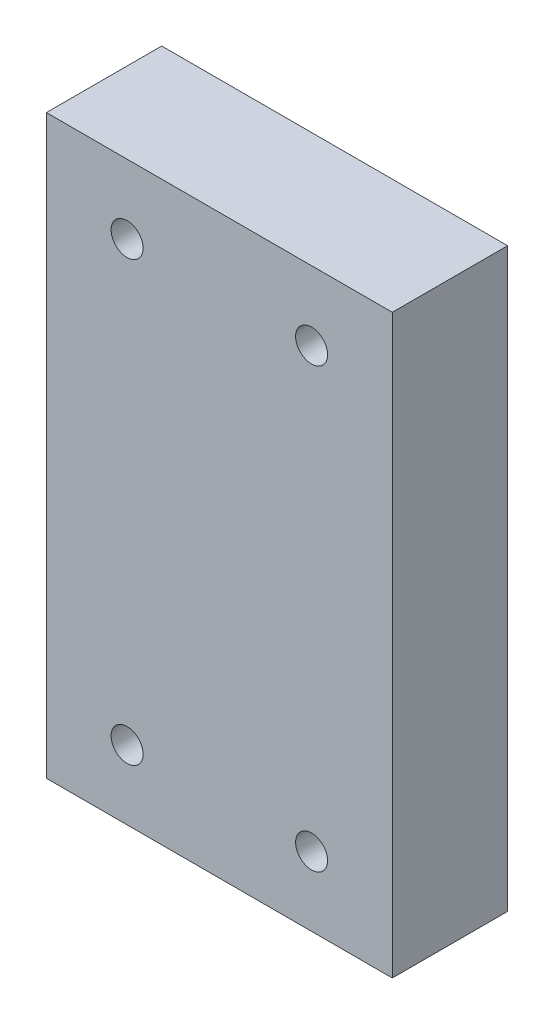
ISO-10303-21;
HEADER;
FILE_DESCRIPTION(('STEP AP214'),'2;1');
FILE_NAME('part.step','',(''),(''),'','','');
FILE_SCHEMA(('AUTOMOTIVE_DESIGN { 1 0 10303 214 1 1 1 1 }'));
ENDSEC;
DATA;
#1=APPLICATION_CONTEXT('core data for automotive mechanical design processes');
#2=APPLICATION_PROTOCOL_DEFINITION('international standard','automotive_design',2000,#1);
#3=PRODUCT_CONTEXT('',#1,'mechanical');
#4=PRODUCT('Part','Part','',(#3));
#5=PRODUCT_RELATED_PRODUCT_CATEGORY('part','',(#4));
#6=PRODUCT_DEFINITION_FORMATION('','',#4);
#7=PRODUCT_DEFINITION_CONTEXT('part definition',#1,'design');
#8=PRODUCT_DEFINITION('design','',#6,#7);
#9=PRODUCT_DEFINITION_SHAPE('','',#8);
#10=(LENGTH_UNIT() NAMED_UNIT(*) SI_UNIT(.MILLI.,.METRE.));
#11=(NAMED_UNIT(*) PLANE_ANGLE_UNIT() SI_UNIT($,.RADIAN.));
#12=(NAMED_UNIT(*) SI_UNIT($,.STERADIAN.) SOLID_ANGLE_UNIT());
#13=UNCERTAINTY_MEASURE_WITH_UNIT(LENGTH_MEASURE(1.E-05),#10,'distance_accuracy_value','');
#14=(GEOMETRIC_REPRESENTATION_CONTEXT(3) GLOBAL_UNCERTAINTY_ASSIGNED_CONTEXT((#13)) GLOBAL_UNIT_ASSIGNED_CONTEXT((#10,
#11,#12)) REPRESENTATION_CONTEXT('',''));
#15=CARTESIAN_POINT('',(0.,0.,0.));
#16=DIRECTION('',(0.,0.,1.));
#17=DIRECTION('',(1.,0.,0.));
#18=AXIS2_PLACEMENT_3D('',#15,#16,#17);
#19=CARTESIAN_POINT('',(0.,0.,10.));
#20=DIRECTION('',(0.,0.,1.));
#21=DIRECTION('',(1.,0.,0.));
#22=AXIS2_PLACEMENT_3D('',#19,#20,#21);
#23=PLANE('',#22);
#24=CARTESIAN_POINT('',(8.,-19.,10.));
#25=DIRECTION('',(0.,0.,1.));
#26=DIRECTION('',(1.,0.,0.));
#27=AXIS2_PLACEMENT_3D('',#24,#25,#26);
#28=CIRCLE('',#27,1.38739495798319);
#29=CARTESIAN_POINT('',(9.3873949579832,-19.,10.));
#30=VERTEX_POINT('',#29);
#31=EDGE_CURVE('E123',#30,#30,#28,.T.);
#32=ORIENTED_EDGE('',*,*,#31,.F.);
#33=EDGE_LOOP('',(#32));
#34=FACE_BOUND('',#33,.T.);
#35=CARTESIAN_POINT('',(-8.,19.,10.));
#36=DIRECTION('',(0.,0.,1.));
#37=DIRECTION('',(1.,0.,0.));
#38=AXIS2_PLACEMENT_3D('',#35,#36,#37);
#39=CIRCLE('',#38,1.38739495798319);
#40=CARTESIAN_POINT('',(-6.6126050420168,19.,10.));
#41=VERTEX_POINT('',#40);
#42=EDGE_CURVE('E102',#41,#41,#39,.T.);
#43=ORIENTED_EDGE('',*,*,#42,.F.);
#44=EDGE_LOOP('',(#43));
#45=FACE_BOUND('',#44,.T.);
#46=DIRECTION('',(0.,-1.,0.));
#47=VECTOR('',#46,1.);
#48=CARTESIAN_POINT('',(-15.,-25.,10.));
#49=LINE('',#48,#47);
#50=CARTESIAN_POINT('',(-15.,25.,10.));
#51=VERTEX_POINT('',#50);
#52=CARTESIAN_POINT('',(-15.,-25.,10.));
#53=VERTEX_POINT('',#52);
#54=EDGE_CURVE('E87',#51,#53,#49,.T.);
#55=ORIENTED_EDGE('',*,*,#54,.T.);
#56=DIRECTION('',(1.,0.,0.));
#57=VECTOR('',#56,1.);
#58=CARTESIAN_POINT('',(15.,-25.,10.));
#59=LINE('',#58,#57);
#60=CARTESIAN_POINT('',(15.,-25.,10.));
#61=VERTEX_POINT('',#60);
#62=EDGE_CURVE('E82',#53,#61,#59,.T.);
#63=ORIENTED_EDGE('',*,*,#62,.T.);
#64=DIRECTION('',(0.,1.,0.));
#65=VECTOR('',#64,1.);
#66=CARTESIAN_POINT('',(15.,-25.,10.));
#67=LINE('',#66,#65);
#68=CARTESIAN_POINT('',(15.,25.,10.));
#69=VERTEX_POINT('',#68);
#70=EDGE_CURVE('E85',#61,#69,#67,.T.);
#71=ORIENTED_EDGE('',*,*,#70,.T.);
#72=DIRECTION('',(-1.,0.,0.));
#73=VECTOR('',#72,1.);
#74=CARTESIAN_POINT('',(15.,25.,10.));
#75=LINE('',#74,#73);
#76=EDGE_CURVE('E52',#69,#51,#75,.T.);
#77=ORIENTED_EDGE('',*,*,#76,.T.);
#78=EDGE_LOOP('',(#55,#63,#71,#77));
#79=FACE_BOUND('',#78,.T.);
#80=CARTESIAN_POINT('',(8.,19.,10.));
#81=DIRECTION('',(0.,0.,1.));
#82=DIRECTION('',(-1.,0.,0.));
#83=AXIS2_PLACEMENT_3D('',#80,#81,#82);
#84=CIRCLE('',#83,1.38739495798319);
#85=CARTESIAN_POINT('',(6.61260504201681,19.,10.));
#86=VERTEX_POINT('',#85);
#87=EDGE_CURVE('E117',#86,#86,#84,.T.);
#88=ORIENTED_EDGE('',*,*,#87,.F.);
#89=EDGE_LOOP('',(#88));
#90=FACE_BOUND('',#89,.T.);
#91=CARTESIAN_POINT('',(-8.,-19.,10.));
#92=DIRECTION('',(0.,0.,1.));
#93=DIRECTION('',(-1.,0.,0.));
#94=AXIS2_PLACEMENT_3D('',#91,#92,#93);
#95=CIRCLE('',#94,1.3873949579832);
#96=CARTESIAN_POINT('',(-9.38739495798319,-19.,10.));
#97=VERTEX_POINT('',#96);
#98=EDGE_CURVE('E129',#97,#97,#95,.T.);
#99=ORIENTED_EDGE('',*,*,#98,.F.);
#100=EDGE_LOOP('',(#99));
#101=FACE_BOUND('',#100,.T.);
#102=ADVANCED_FACE('F35',(#34,#45,#79,#90,#101),#23,.T.);
#103=CARTESIAN_POINT('',(0.,0.,0.));
#104=DIRECTION('',(0.,0.,1.));
#105=DIRECTION('',(1.,0.,0.));
#106=AXIS2_PLACEMENT_3D('',#103,#104,#105);
#107=PLANE('',#106);
#108=DIRECTION('',(0.,-1.,0.));
#109=VECTOR('',#108,1.);
#110=CARTESIAN_POINT('',(-15.,-25.,0.));
#111=LINE('',#110,#109);
#112=CARTESIAN_POINT('',(-15.,25.,0.));
#113=VERTEX_POINT('',#112);
#114=CARTESIAN_POINT('',(-15.,-25.,0.));
#115=VERTEX_POINT('',#114);
#116=EDGE_CURVE('E99',#113,#115,#111,.T.);
#117=ORIENTED_EDGE('',*,*,#116,.F.);
#118=DIRECTION('',(-1.,0.,0.));
#119=VECTOR('',#118,1.);
#120=CARTESIAN_POINT('',(15.,25.,0.));
#121=LINE('',#120,#119);
#122=CARTESIAN_POINT('',(15.,25.,0.));
#123=VERTEX_POINT('',#122);
#124=EDGE_CURVE('E75',#123,#113,#121,.T.);
#125=ORIENTED_EDGE('',*,*,#124,.F.);
#126=DIRECTION('',(0.,1.,0.));
#127=VECTOR('',#126,1.);
#128=CARTESIAN_POINT('',(15.,-25.,0.));
#129=LINE('',#128,#127);
#130=CARTESIAN_POINT('',(15.,-25.,0.));
#131=VERTEX_POINT('',#130);
#132=EDGE_CURVE('E69',#131,#123,#129,.T.);
#133=ORIENTED_EDGE('',*,*,#132,.F.);
#134=DIRECTION('',(1.,0.,0.));
#135=VECTOR('',#134,1.);
#136=CARTESIAN_POINT('',(15.,-25.,0.));
#137=LINE('',#136,#135);
#138=EDGE_CURVE('E91',#115,#131,#137,.T.);
#139=ORIENTED_EDGE('',*,*,#138,.F.);
#140=EDGE_LOOP('',(#117,#125,#133,#139));
#141=FACE_BOUND('',#140,.T.);
#142=CARTESIAN_POINT('',(-8.,19.,0.));
#143=DIRECTION('',(0.,0.,1.));
#144=DIRECTION('',(1.,0.,0.));
#145=AXIS2_PLACEMENT_3D('',#142,#143,#144);
#146=CIRCLE('',#145,1.38739495798319);
#147=CARTESIAN_POINT('',(-6.6126050420168,19.,0.));
#148=VERTEX_POINT('',#147);
#149=EDGE_CURVE('E114',#148,#148,#146,.T.);
#150=ORIENTED_EDGE('',*,*,#149,.T.);
#151=EDGE_LOOP('',(#150));
#152=FACE_BOUND('',#151,.T.);
#153=CARTESIAN_POINT('',(8.,19.,0.));
#154=DIRECTION('',(0.,0.,1.));
#155=DIRECTION('',(-1.,0.,0.));
#156=AXIS2_PLACEMENT_3D('',#153,#154,#155);
#157=CIRCLE('',#156,1.38739495798319);
#158=CARTESIAN_POINT('',(6.61260504201681,19.,0.));
#159=VERTEX_POINT('',#158);
#160=EDGE_CURVE('E120',#159,#159,#157,.T.);
#161=ORIENTED_EDGE('',*,*,#160,.T.);
#162=EDGE_LOOP('',(#161));
#163=FACE_BOUND('',#162,.T.);
#164=CARTESIAN_POINT('',(8.,-19.,0.));
#165=DIRECTION('',(0.,0.,1.));
#166=DIRECTION('',(1.,0.,0.));
#167=AXIS2_PLACEMENT_3D('',#164,#165,#166);
#168=CIRCLE('',#167,1.38739495798319);
#169=CARTESIAN_POINT('',(9.3873949579832,-19.,0.));
#170=VERTEX_POINT('',#169);
#171=EDGE_CURVE('E126',#170,#170,#168,.T.);
#172=ORIENTED_EDGE('',*,*,#171,.T.);
#173=EDGE_LOOP('',(#172));
#174=FACE_BOUND('',#173,.T.);
#175=CARTESIAN_POINT('',(-8.,-19.,0.));
#176=DIRECTION('',(0.,0.,1.));
#177=DIRECTION('',(-1.,0.,0.));
#178=AXIS2_PLACEMENT_3D('',#175,#176,#177);
#179=CIRCLE('',#178,1.3873949579832);
#180=CARTESIAN_POINT('',(-9.38739495798319,-19.,0.));
#181=VERTEX_POINT('',#180);
#182=EDGE_CURVE('E132',#181,#181,#179,.T.);
#183=ORIENTED_EDGE('',*,*,#182,.T.);
#184=EDGE_LOOP('',(#183));
#185=FACE_BOUND('',#184,.T.);
#186=ADVANCED_FACE('F110',(#141,#152,#163,#174,#185),#107,.F.);
#187=CARTESIAN_POINT('',(-15.,-25.,10.));
#188=DIRECTION('',(1.,0.,0.));
#189=DIRECTION('',(0.,1.,0.));
#190=AXIS2_PLACEMENT_3D('',#187,#188,#189);
#191=PLANE('',#190);
#192=CARTESIAN_POINT('',(-15.,12.5,5.));
#193=DIRECTION('',(-1.,0.,0.));
#194=DIRECTION('',(0.,-1.,0.));
#195=AXIS2_PLACEMENT_3D('',#192,#193,#194);
#196=CIRCLE('',#195,2.);
#197=CARTESIAN_POINT('',(-15.,10.5,5.));
#198=VERTEX_POINT('',#197);
#199=EDGE_CURVE('E144',#198,#198,#196,.T.);
#200=ORIENTED_EDGE('',*,*,#199,.F.);
#201=EDGE_LOOP('',(#200));
#202=FACE_BOUND('',#201,.T.);
#203=CARTESIAN_POINT('',(-15.,-12.5,5.00000000000001));
#204=DIRECTION('',(-1.,0.,0.));
#205=DIRECTION('',(0.,1.,0.));
#206=AXIS2_PLACEMENT_3D('',#203,#204,#205);
#207=CIRCLE('',#206,2.);
#208=CARTESIAN_POINT('',(-15.,-10.5,5.00000000000001));
#209=VERTEX_POINT('',#208);
#210=EDGE_CURVE('E138',#209,#209,#207,.T.);
#211=ORIENTED_EDGE('',*,*,#210,.F.);
#212=EDGE_LOOP('',(#211));
#213=FACE_BOUND('',#212,.T.);
#214=ORIENTED_EDGE('',*,*,#116,.T.);
#215=DIRECTION('',(0.,0.,-1.));
#216=VECTOR('',#215,1.);
#217=CARTESIAN_POINT('',(-15.,-25.,10.));
#218=LINE('',#217,#216);
#219=EDGE_CURVE('E11',#53,#115,#218,.T.);
#220=ORIENTED_EDGE('',*,*,#219,.F.);
#221=ORIENTED_EDGE('',*,*,#54,.F.);
#222=DIRECTION('',(0.,0.,-1.));
#223=VECTOR('',#222,1.);
#224=CARTESIAN_POINT('',(-15.,25.,10.));
#225=LINE('',#224,#223);
#226=EDGE_CURVE('E95',#51,#113,#225,.T.);
#227=ORIENTED_EDGE('',*,*,#226,.T.);
#228=EDGE_LOOP('',(#214,#220,#221,#227));
#229=FACE_BOUND('',#228,.T.);
#230=ADVANCED_FACE('F37',(#202,#213,#229),#191,.F.);
#231=CARTESIAN_POINT('',(15.,-25.,10.));
#232=DIRECTION('',(0.,1.,0.));
#233=DIRECTION('',(-1.,0.,0.));
#234=AXIS2_PLACEMENT_3D('',#231,#232,#233);
#235=PLANE('',#234);
#236=ORIENTED_EDGE('',*,*,#138,.T.);
#237=DIRECTION('',(0.,0.,-1.));
#238=VECTOR('',#237,1.);
#239=CARTESIAN_POINT('',(15.,-25.,10.));
#240=LINE('',#239,#238);
#241=EDGE_CURVE('E44',#61,#131,#240,.T.);
#242=ORIENTED_EDGE('',*,*,#241,.F.);
#243=ORIENTED_EDGE('',*,*,#62,.F.);
#244=ORIENTED_EDGE('',*,*,#219,.T.);
#245=EDGE_LOOP('',(#236,#242,#243,#244));
#246=FACE_BOUND('',#245,.T.);
#247=ADVANCED_FACE('F90',(#246),#235,.F.);
#248=CARTESIAN_POINT('',(15.,-25.,10.));
#249=DIRECTION('',(-1.,0.,0.));
#250=DIRECTION('',(0.,0.,1.));
#251=AXIS2_PLACEMENT_3D('',#248,#249,#250);
#252=PLANE('',#251);
#253=ORIENTED_EDGE('',*,*,#132,.T.);
#254=DIRECTION('',(0.,0.,-1.));
#255=VECTOR('',#254,1.);
#256=CARTESIAN_POINT('',(15.,25.,10.));
#257=LINE('',#256,#255);
#258=EDGE_CURVE('E92',#69,#123,#257,.T.);
#259=ORIENTED_EDGE('',*,*,#258,.F.);
#260=ORIENTED_EDGE('',*,*,#70,.F.);
#261=ORIENTED_EDGE('',*,*,#241,.T.);
#262=EDGE_LOOP('',(#253,#259,#260,#261));
#263=FACE_BOUND('',#262,.T.);
#264=ADVANCED_FACE('F93',(#263),#252,.F.);
#265=CARTESIAN_POINT('',(15.,25.,10.));
#266=DIRECTION('',(0.,-1.,0.));
#267=DIRECTION('',(1.,0.,0.));
#268=AXIS2_PLACEMENT_3D('',#265,#266,#267);
#269=PLANE('',#268);
#270=ORIENTED_EDGE('',*,*,#124,.T.);
#271=ORIENTED_EDGE('',*,*,#226,.F.);
#272=ORIENTED_EDGE('',*,*,#76,.F.);
#273=ORIENTED_EDGE('',*,*,#258,.T.);
#274=EDGE_LOOP('',(#270,#271,#272,#273));
#275=FACE_BOUND('',#274,.T.);
#276=ADVANCED_FACE('F107',(#275),#269,.F.);
#277=CARTESIAN_POINT('',(-8.,19.,10.));
#278=DIRECTION('',(0.,0.,-1.));
#279=DIRECTION('',(-1.,0.,0.));
#280=AXIS2_PLACEMENT_3D('',#277,#278,#279);
#281=CYLINDRICAL_SURFACE('',#280,1.38739495798319);
#282=ORIENTED_EDGE('',*,*,#42,.T.);
#283=EDGE_LOOP('',(#282));
#284=FACE_BOUND('',#283,.T.);
#285=ORIENTED_EDGE('',*,*,#149,.F.);
#286=EDGE_LOOP('',(#285));
#287=FACE_BOUND('',#286,.T.);
#288=ADVANCED_FACE('F188',(#284,#287),#281,.F.);
#289=CARTESIAN_POINT('',(8.,19.,10.));
#290=DIRECTION('',(0.,0.,-1.));
#291=DIRECTION('',(-1.,0.,0.));
#292=AXIS2_PLACEMENT_3D('',#289,#290,#291);
#293=CYLINDRICAL_SURFACE('',#292,1.38739495798319);
#294=ORIENTED_EDGE('',*,*,#87,.T.);
#295=EDGE_LOOP('',(#294));
#296=FACE_BOUND('',#295,.T.);
#297=ORIENTED_EDGE('',*,*,#160,.F.);
#298=EDGE_LOOP('',(#297));
#299=FACE_BOUND('',#298,.T.);
#300=ADVANCED_FACE('F217',(#296,#299),#293,.F.);
#301=CARTESIAN_POINT('',(8.,-19.,10.));
#302=DIRECTION('',(0.,0.,-1.));
#303=DIRECTION('',(-1.,0.,0.));
#304=AXIS2_PLACEMENT_3D('',#301,#302,#303);
#305=CYLINDRICAL_SURFACE('',#304,1.38739495798319);
#306=ORIENTED_EDGE('',*,*,#31,.T.);
#307=EDGE_LOOP('',(#306));
#308=FACE_BOUND('',#307,.T.);
#309=ORIENTED_EDGE('',*,*,#171,.F.);
#310=EDGE_LOOP('',(#309));
#311=FACE_BOUND('',#310,.T.);
#312=ADVANCED_FACE('F174',(#308,#311),#305,.F.);
#313=CARTESIAN_POINT('',(-8.,-19.,10.));
#314=DIRECTION('',(0.,0.,-1.));
#315=DIRECTION('',(-1.,0.,0.));
#316=AXIS2_PLACEMENT_3D('',#313,#314,#315);
#317=CYLINDRICAL_SURFACE('',#316,1.3873949579832);
#318=ORIENTED_EDGE('',*,*,#98,.T.);
#319=EDGE_LOOP('',(#318));
#320=FACE_BOUND('',#319,.T.);
#321=ORIENTED_EDGE('',*,*,#182,.F.);
#322=EDGE_LOOP('',(#321));
#323=FACE_BOUND('',#322,.T.);
#324=ADVANCED_FACE('F165',(#320,#323),#317,.F.);
#325=CARTESIAN_POINT('',(-5.,-12.5,5.00000000000001));
#326=DIRECTION('',(-1.,0.,0.));
#327=DIRECTION('',(0.,-1.,0.));
#328=AXIS2_PLACEMENT_3D('',#325,#326,#327);
#329=CYLINDRICAL_SURFACE('',#328,2.);
#330=CARTESIAN_POINT('',(-5.,-12.5,5.00000000000001));
#331=DIRECTION('',(-1.,0.,0.));
#332=DIRECTION('',(0.,1.,0.));
#333=AXIS2_PLACEMENT_3D('',#330,#331,#332);
#334=CIRCLE('',#333,2.);
#335=CARTESIAN_POINT('',(-5.,-10.5,5.00000000000001));
#336=VERTEX_POINT('',#335);
#337=EDGE_CURVE('E141',#336,#336,#334,.T.);
#338=ORIENTED_EDGE('',*,*,#337,.F.);
#339=EDGE_LOOP('',(#338));
#340=FACE_BOUND('',#339,.T.);
#341=ORIENTED_EDGE('',*,*,#210,.T.);
#342=EDGE_LOOP('',(#341));
#343=FACE_BOUND('',#342,.T.);
#344=ADVANCED_FACE('F163',(#340,#343),#329,.F.);
#345=CARTESIAN_POINT('',(-5.,-12.5,5.00000000000001));
#346=DIRECTION('',(1.,0.,0.));
#347=DIRECTION('',(0.,1.,0.));
#348=AXIS2_PLACEMENT_3D('',#345,#346,#347);
#349=PLANE('',#348);
#350=ORIENTED_EDGE('',*,*,#337,.T.);
#351=EDGE_LOOP('',(#350));
#352=FACE_BOUND('',#351,.T.);
#353=ADVANCED_FACE('F155',(#352),#349,.F.);
#354=CARTESIAN_POINT('',(-5.,12.5,5.));
#355=DIRECTION('',(-1.,0.,0.));
#356=DIRECTION('',(0.,-1.,0.));
#357=AXIS2_PLACEMENT_3D('',#354,#355,#356);
#358=CYLINDRICAL_SURFACE('',#357,2.);
#359=CARTESIAN_POINT('',(-5.,12.5,5.));
#360=DIRECTION('',(-1.,0.,0.));
#361=DIRECTION('',(0.,-1.,0.));
#362=AXIS2_PLACEMENT_3D('',#359,#360,#361);
#363=CIRCLE('',#362,2.);
#364=CARTESIAN_POINT('',(-5.,10.5,5.));
#365=VERTEX_POINT('',#364);
#366=EDGE_CURVE('E135',#365,#365,#363,.T.);
#367=ORIENTED_EDGE('',*,*,#366,.F.);
#368=EDGE_LOOP('',(#367));
#369=FACE_BOUND('',#368,.T.);
#370=ORIENTED_EDGE('',*,*,#199,.T.);
#371=EDGE_LOOP('',(#370));
#372=FACE_BOUND('',#371,.T.);
#373=ADVANCED_FACE('F152',(#369,#372),#358,.F.);
#374=CARTESIAN_POINT('',(-5.,12.5,5.));
#375=DIRECTION('',(-1.,0.,0.));
#376=DIRECTION('',(0.,-1.,0.));
#377=AXIS2_PLACEMENT_3D('',#374,#375,#376);
#378=PLANE('',#377);
#379=ORIENTED_EDGE('',*,*,#366,.T.);
#380=EDGE_LOOP('',(#379));
#381=FACE_BOUND('',#380,.T.);
#382=ADVANCED_FACE('F150',(#381),#378,.T.);
#383=CLOSED_SHELL('',(#102,#186,#230,#247,#264,#276,#288,#300,#312,#324,#344,#353,#373,#382));
#384=MANIFOLD_SOLID_BREP('B2',#383);
#385=ADVANCED_BREP_SHAPE_REPRESENTATION('',(#18,#384),#14);
#386=SHAPE_DEFINITION_REPRESENTATION(#9,#385);
ENDSEC;
END-ISO-10303-21;
